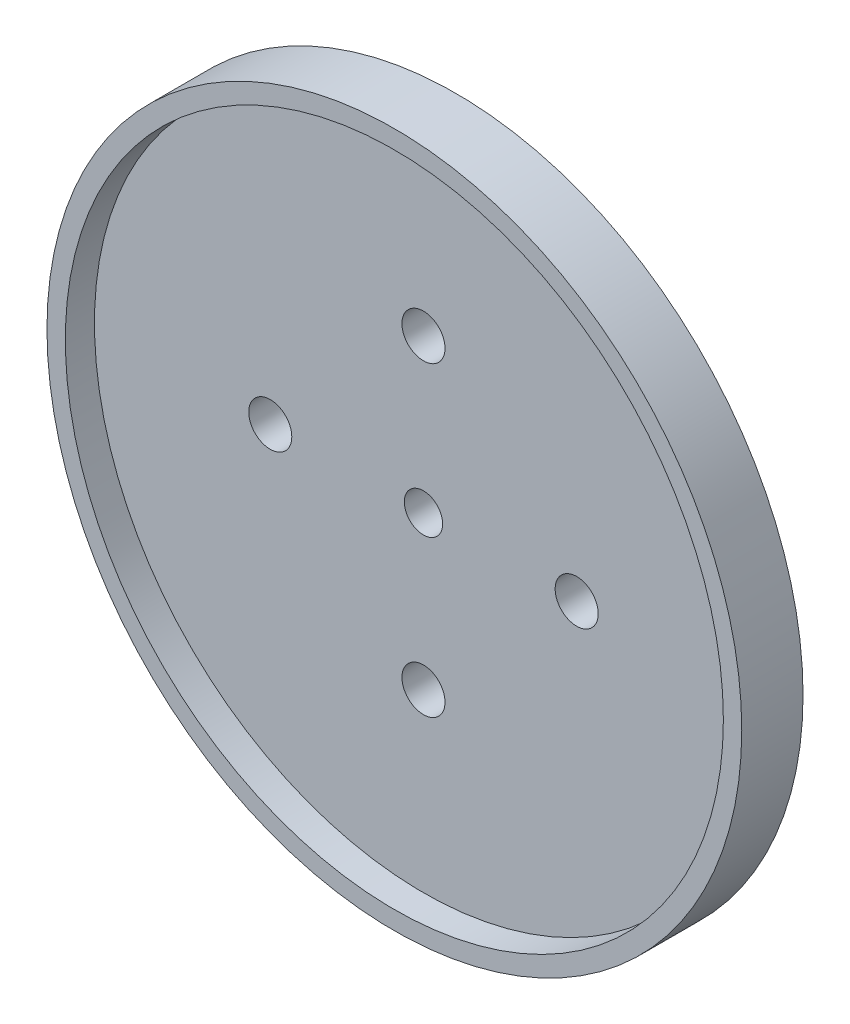
ISO-10303-21;
HEADER;
FILE_DESCRIPTION(('STEP AP214'),'2;1');
FILE_NAME('part.step','',(''),(''),'','','');
FILE_SCHEMA(('AUTOMOTIVE_DESIGN { 1 0 10303 214 1 1 1 1 }'));
ENDSEC;
DATA;
#1=APPLICATION_CONTEXT('core data for automotive mechanical design processes');
#2=APPLICATION_PROTOCOL_DEFINITION('international standard','automotive_design',2000,#1);
#3=PRODUCT_CONTEXT('',#1,'mechanical');
#4=PRODUCT('Part','Part','',(#3));
#5=PRODUCT_RELATED_PRODUCT_CATEGORY('part','',(#4));
#6=PRODUCT_DEFINITION_FORMATION('','',#4);
#7=PRODUCT_DEFINITION_CONTEXT('part definition',#1,'design');
#8=PRODUCT_DEFINITION('design','',#6,#7);
#9=PRODUCT_DEFINITION_SHAPE('','',#8);
#10=(LENGTH_UNIT() NAMED_UNIT(*) SI_UNIT(.MILLI.,.METRE.));
#11=(NAMED_UNIT(*) PLANE_ANGLE_UNIT() SI_UNIT($,.RADIAN.));
#12=(NAMED_UNIT(*) SI_UNIT($,.STERADIAN.) SOLID_ANGLE_UNIT());
#13=UNCERTAINTY_MEASURE_WITH_UNIT(LENGTH_MEASURE(1.E-05),#10,'distance_accuracy_value','');
#14=(GEOMETRIC_REPRESENTATION_CONTEXT(3) GLOBAL_UNCERTAINTY_ASSIGNED_CONTEXT((#13)) GLOBAL_UNIT_ASSIGNED_CONTEXT((#10,
#11,#12)) REPRESENTATION_CONTEXT('',''));
#15=CARTESIAN_POINT('',(0.,0.,0.));
#16=DIRECTION('',(0.,0.,1.));
#17=DIRECTION('',(1.,0.,0.));
#18=AXIS2_PLACEMENT_3D('',#15,#16,#17);
#19=CARTESIAN_POINT('',(0.,0.,10.16));
#20=DIRECTION('',(0.,0.,-1.));
#21=DIRECTION('',(-1.,0.,0.));
#22=AXIS2_PLACEMENT_3D('',#19,#20,#21);
#23=CYLINDRICAL_SURFACE('',#22,57.5945);
#24=CARTESIAN_POINT('',(0.,0.,10.16));
#25=DIRECTION('',(0.,0.,1.));
#26=DIRECTION('',(1.,0.,0.));
#27=AXIS2_PLACEMENT_3D('',#24,#25,#26);
#28=CIRCLE('',#27,57.5945);
#29=CARTESIAN_POINT('',(57.5945,0.,10.16));
#30=VERTEX_POINT('',#29);
#31=EDGE_CURVE('E10',#30,#30,#28,.T.);
#32=ORIENTED_EDGE('',*,*,#31,.F.);
#33=EDGE_LOOP('',(#32));
#34=FACE_BOUND('',#33,.T.);
#35=CARTESIAN_POINT('',(0.,0.,0.));
#36=DIRECTION('',(0.,0.,1.));
#37=DIRECTION('',(1.,0.,0.));
#38=AXIS2_PLACEMENT_3D('',#35,#36,#37);
#39=CIRCLE('',#38,57.5945);
#40=CARTESIAN_POINT('',(57.5945,0.,0.));
#41=VERTEX_POINT('',#40);
#42=EDGE_CURVE('E35',#41,#41,#39,.T.);
#43=ORIENTED_EDGE('',*,*,#42,.T.);
#44=EDGE_LOOP('',(#43));
#45=FACE_BOUND('',#44,.T.);
#46=ADVANCED_FACE('F32',(#34,#45),#23,.T.);
#47=CARTESIAN_POINT('',(0.,0.,10.16));
#48=DIRECTION('',(0.,0.,1.));
#49=DIRECTION('',(1.,0.,0.));
#50=AXIS2_PLACEMENT_3D('',#47,#48,#49);
#51=PLANE('',#50);
#52=CARTESIAN_POINT('',(0.,0.,10.16));
#53=DIRECTION('',(0.,0.,1.));
#54=DIRECTION('',(1.,0.,0.));
#55=AXIS2_PLACEMENT_3D('',#52,#53,#54);
#56=CIRCLE('',#55,54.5465);
#57=CARTESIAN_POINT('',(54.5465,0.,10.16));
#58=VERTEX_POINT('',#57);
#59=EDGE_CURVE('E44',#58,#58,#56,.T.);
#60=ORIENTED_EDGE('',*,*,#59,.F.);
#61=EDGE_LOOP('',(#60));
#62=FACE_BOUND('',#61,.T.);
#63=ORIENTED_EDGE('',*,*,#31,.T.);
#64=EDGE_LOOP('',(#63));
#65=FACE_BOUND('',#64,.T.);
#66=ADVANCED_FACE('F104',(#62,#65),#51,.T.);
#67=CARTESIAN_POINT('',(0.,0.,0.));
#68=DIRECTION('',(0.,0.,1.));
#69=DIRECTION('',(1.,0.,0.));
#70=AXIS2_PLACEMENT_3D('',#67,#68,#69);
#71=PLANE('',#70);
#72=CARTESIAN_POINT('',(2.66051032116535E-13,25.4,0.));
#73=DIRECTION('',(0.,0.,1.));
#74=DIRECTION('',(1.,0.,0.));
#75=AXIS2_PLACEMENT_3D('',#72,#73,#74);
#76=CIRCLE('',#75,3.57124);
#77=CARTESIAN_POINT('',(3.57124000000026,25.4,0.));
#78=VERTEX_POINT('',#77);
#79=EDGE_CURVE('E73',#78,#78,#76,.T.);
#80=ORIENTED_EDGE('',*,*,#79,.T.);
#81=EDGE_LOOP('',(#80));
#82=FACE_BOUND('',#81,.T.);
#83=CARTESIAN_POINT('',(-25.4,1.77367354744357E-13,0.));
#84=DIRECTION('',(0.,0.,1.));
#85=DIRECTION('',(1.,0.,0.));
#86=AXIS2_PLACEMENT_3D('',#83,#84,#85);
#87=CIRCLE('',#86,3.57124);
#88=CARTESIAN_POINT('',(-21.82876,1.77367354744357E-13,0.));
#89=VERTEX_POINT('',#88);
#90=EDGE_CURVE('E67',#89,#89,#87,.T.);
#91=ORIENTED_EDGE('',*,*,#90,.T.);
#92=EDGE_LOOP('',(#91));
#93=FACE_BOUND('',#92,.T.);
#94=CARTESIAN_POINT('',(0.,-25.4,0.));
#95=DIRECTION('',(0.,0.,1.));
#96=DIRECTION('',(1.,0.,0.));
#97=AXIS2_PLACEMENT_3D('',#94,#95,#96);
#98=CIRCLE('',#97,3.57124);
#99=CARTESIAN_POINT('',(3.57123999999991,-25.4,0.));
#100=VERTEX_POINT('',#99);
#101=EDGE_CURVE('E61',#100,#100,#98,.T.);
#102=ORIENTED_EDGE('',*,*,#101,.T.);
#103=EDGE_LOOP('',(#102));
#104=FACE_BOUND('',#103,.T.);
#105=CARTESIAN_POINT('',(25.4,0.,0.));
#106=DIRECTION('',(0.,0.,1.));
#107=DIRECTION('',(1.,0.,0.));
#108=AXIS2_PLACEMENT_3D('',#105,#106,#107);
#109=CIRCLE('',#108,3.57124);
#110=CARTESIAN_POINT('',(28.97124,0.,0.));
#111=VERTEX_POINT('',#110);
#112=EDGE_CURVE('E55',#111,#111,#109,.T.);
#113=ORIENTED_EDGE('',*,*,#112,.T.);
#114=EDGE_LOOP('',(#113));
#115=FACE_BOUND('',#114,.T.);
#116=CARTESIAN_POINT('',(0.,0.,0.));
#117=DIRECTION('',(0.,0.,1.));
#118=DIRECTION('',(1.,0.,0.));
#119=AXIS2_PLACEMENT_3D('',#116,#117,#118);
#120=CIRCLE('',#119,3.17499999999999);
#121=CARTESIAN_POINT('',(3.17499999999999,0.,0.));
#122=VERTEX_POINT('',#121);
#123=EDGE_CURVE('E47',#122,#122,#120,.T.);
#124=ORIENTED_EDGE('',*,*,#123,.T.);
#125=EDGE_LOOP('',(#124));
#126=FACE_BOUND('',#125,.T.);
#127=ORIENTED_EDGE('',*,*,#42,.F.);
#128=EDGE_LOOP('',(#127));
#129=FACE_BOUND('',#128,.T.);
#130=ADVANCED_FACE('F100',(#82,#93,#104,#115,#126,#129),#71,.F.);
#131=CARTESIAN_POINT('',(0.,0.,5.334));
#132=DIRECTION('',(0.,0.,1.));
#133=DIRECTION('',(1.,0.,0.));
#134=AXIS2_PLACEMENT_3D('',#131,#132,#133);
#135=CYLINDRICAL_SURFACE('',#134,54.5465);
#136=CARTESIAN_POINT('',(0.,0.,5.334));
#137=DIRECTION('',(0.,0.,1.));
#138=DIRECTION('',(1.,0.,0.));
#139=AXIS2_PLACEMENT_3D('',#136,#137,#138);
#140=CIRCLE('',#139,54.5465);
#141=CARTESIAN_POINT('',(54.5465,0.,5.334));
#142=VERTEX_POINT('',#141);
#143=EDGE_CURVE('E42',#142,#142,#140,.T.);
#144=ORIENTED_EDGE('',*,*,#143,.F.);
#145=EDGE_LOOP('',(#144));
#146=FACE_BOUND('',#145,.T.);
#147=ORIENTED_EDGE('',*,*,#59,.T.);
#148=EDGE_LOOP('',(#147));
#149=FACE_BOUND('',#148,.T.);
#150=ADVANCED_FACE('F86',(#146,#149),#135,.F.);
#151=CARTESIAN_POINT('',(0.,0.,5.334));
#152=DIRECTION('',(0.,0.,1.));
#153=DIRECTION('',(1.,0.,0.));
#154=AXIS2_PLACEMENT_3D('',#151,#152,#153);
#155=PLANE('',#154);
#156=CARTESIAN_POINT('',(2.66051032116535E-13,25.4,5.334));
#157=DIRECTION('',(0.,0.,1.));
#158=DIRECTION('',(1.,0.,0.));
#159=AXIS2_PLACEMENT_3D('',#156,#157,#158);
#160=CIRCLE('',#159,3.57123999999999);
#161=CARTESIAN_POINT('',(3.57124000000025,25.4,5.334));
#162=VERTEX_POINT('',#161);
#163=EDGE_CURVE('E76',#162,#162,#160,.T.);
#164=ORIENTED_EDGE('',*,*,#163,.F.);
#165=EDGE_LOOP('',(#164));
#166=FACE_BOUND('',#165,.T.);
#167=CARTESIAN_POINT('',(-25.4,1.77367354744357E-13,5.334));
#168=DIRECTION('',(0.,0.,1.));
#169=DIRECTION('',(1.,0.,0.));
#170=AXIS2_PLACEMENT_3D('',#167,#168,#169);
#171=CIRCLE('',#170,3.57123999999999);
#172=CARTESIAN_POINT('',(-21.82876,1.77367354744357E-13,5.334));
#173=VERTEX_POINT('',#172);
#174=EDGE_CURVE('E70',#173,#173,#171,.T.);
#175=ORIENTED_EDGE('',*,*,#174,.F.);
#176=EDGE_LOOP('',(#175));
#177=FACE_BOUND('',#176,.T.);
#178=CARTESIAN_POINT('',(0.,-25.4,5.334));
#179=DIRECTION('',(0.,0.,1.));
#180=DIRECTION('',(1.,0.,0.));
#181=AXIS2_PLACEMENT_3D('',#178,#179,#180);
#182=CIRCLE('',#181,3.57123999999999);
#183=CARTESIAN_POINT('',(3.5712399999999,-25.4,5.334));
#184=VERTEX_POINT('',#183);
#185=EDGE_CURVE('E64',#184,#184,#182,.T.);
#186=ORIENTED_EDGE('',*,*,#185,.F.);
#187=EDGE_LOOP('',(#186));
#188=FACE_BOUND('',#187,.T.);
#189=CARTESIAN_POINT('',(25.4,0.,5.334));
#190=DIRECTION('',(0.,0.,1.));
#191=DIRECTION('',(1.,0.,0.));
#192=AXIS2_PLACEMENT_3D('',#189,#190,#191);
#193=CIRCLE('',#192,3.57123999999999);
#194=CARTESIAN_POINT('',(28.97124,0.,5.334));
#195=VERTEX_POINT('',#194);
#196=EDGE_CURVE('E58',#195,#195,#193,.T.);
#197=ORIENTED_EDGE('',*,*,#196,.F.);
#198=EDGE_LOOP('',(#197));
#199=FACE_BOUND('',#198,.T.);
#200=CARTESIAN_POINT('',(0.,0.,5.334));
#201=DIRECTION('',(0.,0.,1.));
#202=DIRECTION('',(1.,0.,0.));
#203=AXIS2_PLACEMENT_3D('',#200,#201,#202);
#204=CIRCLE('',#203,3.17499999999999);
#205=CARTESIAN_POINT('',(3.17499999999999,0.,5.334));
#206=VERTEX_POINT('',#205);
#207=EDGE_CURVE('E52',#206,#206,#204,.T.);
#208=ORIENTED_EDGE('',*,*,#207,.F.);
#209=EDGE_LOOP('',(#208));
#210=FACE_BOUND('',#209,.T.);
#211=ORIENTED_EDGE('',*,*,#143,.T.);
#212=EDGE_LOOP('',(#211));
#213=FACE_BOUND('',#212,.T.);
#214=ADVANCED_FACE('F82',(#166,#177,#188,#199,#210,#213),#155,.T.);
#215=CARTESIAN_POINT('',(0.,0.,5.334));
#216=DIRECTION('',(0.,0.,1.));
#217=DIRECTION('',(1.,0.,0.));
#218=AXIS2_PLACEMENT_3D('',#215,#216,#217);
#219=CYLINDRICAL_SURFACE('',#218,3.17499999999999);
#220=ORIENTED_EDGE('',*,*,#207,.T.);
#221=EDGE_LOOP('',(#220));
#222=FACE_BOUND('',#221,.T.);
#223=ORIENTED_EDGE('',*,*,#123,.F.);
#224=EDGE_LOOP('',(#223));
#225=FACE_BOUND('',#224,.T.);
#226=ADVANCED_FACE('F85',(#222,#225),#219,.F.);
#227=CARTESIAN_POINT('',(25.4,0.,5.334));
#228=DIRECTION('',(0.,0.,1.));
#229=DIRECTION('',(1.,0.,0.));
#230=AXIS2_PLACEMENT_3D('',#227,#228,#229);
#231=CYLINDRICAL_SURFACE('',#230,3.57123999999999);
#232=ORIENTED_EDGE('',*,*,#112,.F.);
#233=EDGE_LOOP('',(#232));
#234=FACE_BOUND('',#233,.T.);
#235=ORIENTED_EDGE('',*,*,#196,.T.);
#236=EDGE_LOOP('',(#235));
#237=FACE_BOUND('',#236,.T.);
#238=ADVANCED_FACE('F116',(#234,#237),#231,.F.);
#239=CARTESIAN_POINT('',(0.,-25.4,5.334));
#240=DIRECTION('',(0.,0.,1.));
#241=DIRECTION('',(1.,0.,0.));
#242=AXIS2_PLACEMENT_3D('',#239,#240,#241);
#243=CYLINDRICAL_SURFACE('',#242,3.57123999999999);
#244=ORIENTED_EDGE('',*,*,#101,.F.);
#245=EDGE_LOOP('',(#244));
#246=FACE_BOUND('',#245,.T.);
#247=ORIENTED_EDGE('',*,*,#185,.T.);
#248=EDGE_LOOP('',(#247));
#249=FACE_BOUND('',#248,.T.);
#250=ADVANCED_FACE('F120',(#246,#249),#243,.F.);
#251=CARTESIAN_POINT('',(-25.4,1.77367354744357E-13,5.334));
#252=DIRECTION('',(0.,0.,1.));
#253=DIRECTION('',(1.,0.,0.));
#254=AXIS2_PLACEMENT_3D('',#251,#252,#253);
#255=CYLINDRICAL_SURFACE('',#254,3.57123999999999);
#256=ORIENTED_EDGE('',*,*,#90,.F.);
#257=EDGE_LOOP('',(#256));
#258=FACE_BOUND('',#257,.T.);
#259=ORIENTED_EDGE('',*,*,#174,.T.);
#260=EDGE_LOOP('',(#259));
#261=FACE_BOUND('',#260,.T.);
#262=ADVANCED_FACE('F124',(#258,#261),#255,.F.);
#263=CARTESIAN_POINT('',(2.66051032116535E-13,25.4,5.334));
#264=DIRECTION('',(0.,0.,1.));
#265=DIRECTION('',(1.,0.,0.));
#266=AXIS2_PLACEMENT_3D('',#263,#264,#265);
#267=CYLINDRICAL_SURFACE('',#266,3.57123999999999);
#268=ORIENTED_EDGE('',*,*,#79,.F.);
#269=EDGE_LOOP('',(#268));
#270=FACE_BOUND('',#269,.T.);
#271=ORIENTED_EDGE('',*,*,#163,.T.);
#272=EDGE_LOOP('',(#271));
#273=FACE_BOUND('',#272,.T.);
#274=ADVANCED_FACE('F80',(#270,#273),#267,.F.);
#275=CLOSED_SHELL('',(#46,#66,#130,#150,#214,#226,#238,#250,#262,#274));
#276=MANIFOLD_SOLID_BREP('B2',#275);
#277=ADVANCED_BREP_SHAPE_REPRESENTATION('',(#18,#276),#14);
#278=SHAPE_DEFINITION_REPRESENTATION(#9,#277);
ENDSEC;
END-ISO-10303-21;
